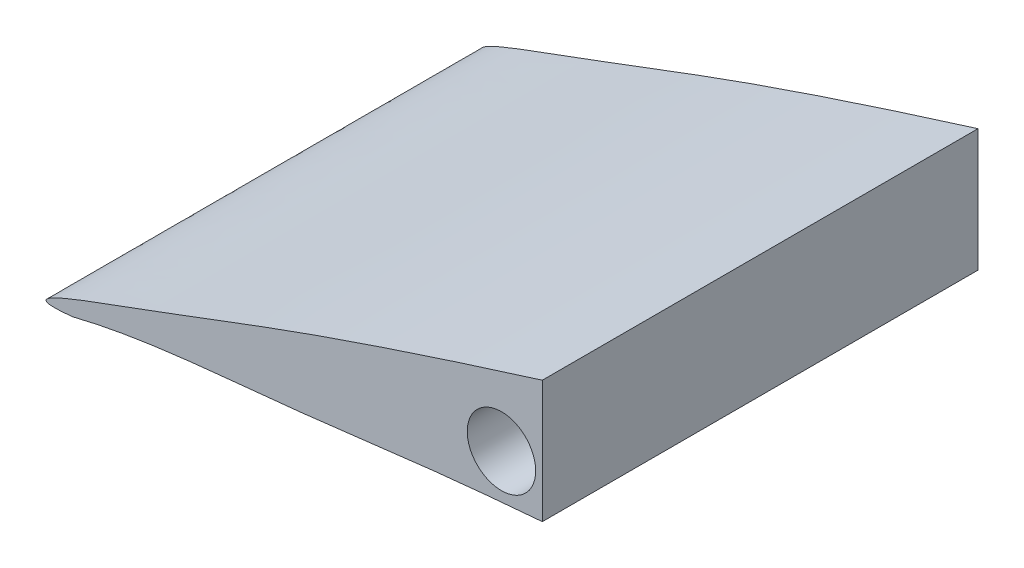
ISO-10303-21;
HEADER;
FILE_DESCRIPTION(('STEP AP214'),'2;1');
FILE_NAME('part.step','',(''),(''),'','','');
FILE_SCHEMA(('AUTOMOTIVE_DESIGN { 1 0 10303 214 1 1 1 1 }'));
ENDSEC;
DATA;
#1=APPLICATION_CONTEXT('core data for automotive mechanical design processes');
#2=APPLICATION_PROTOCOL_DEFINITION('international standard','automotive_design',2000,#1);
#3=PRODUCT_CONTEXT('',#1,'mechanical');
#4=PRODUCT('Part','Part','',(#3));
#5=PRODUCT_RELATED_PRODUCT_CATEGORY('part','',(#4));
#6=PRODUCT_DEFINITION_FORMATION('','',#4);
#7=PRODUCT_DEFINITION_CONTEXT('part definition',#1,'design');
#8=PRODUCT_DEFINITION('design','',#6,#7);
#9=PRODUCT_DEFINITION_SHAPE('','',#8);
#10=(LENGTH_UNIT() NAMED_UNIT(*) SI_UNIT(.MILLI.,.METRE.));
#11=(NAMED_UNIT(*) PLANE_ANGLE_UNIT() SI_UNIT($,.RADIAN.));
#12=(NAMED_UNIT(*) SI_UNIT($,.STERADIAN.) SOLID_ANGLE_UNIT());
#13=UNCERTAINTY_MEASURE_WITH_UNIT(LENGTH_MEASURE(1.E-05),#10,'distance_accuracy_value','');
#14=(GEOMETRIC_REPRESENTATION_CONTEXT(3) GLOBAL_UNCERTAINTY_ASSIGNED_CONTEXT((#13)) GLOBAL_UNIT_ASSIGNED_CONTEXT((#10,
#11,#12)) REPRESENTATION_CONTEXT('',''));
#15=CARTESIAN_POINT('',(0.,0.,0.));
#16=DIRECTION('',(0.,0.,1.));
#17=DIRECTION('',(1.,0.,0.));
#18=AXIS2_PLACEMENT_3D('',#15,#16,#17);
#19=CARTESIAN_POINT('',(-6.3156767121804,2.1580285927083,27.0764));
#20=DIRECTION('',(0.,0.,-1.));
#21=DIRECTION('',(-1.,0.,0.));
#22=AXIS2_PLACEMENT_3D('',#19,#20,#21);
#23=PLANE('',#22);
#24=CARTESIAN_POINT('',(-45.7724895500792,-12.1068503903365,27.0764));
#25=CARTESIAN_POINT('',(-41.3374436992652,-10.9992654887815,27.0764));
#26=CARTESIAN_POINT('',(-33.8316096279073,-10.5300430967119,27.0764));
#27=CARTESIAN_POINT('',(-20.4834982570784,-8.70754719775505,27.0764));
#28=CARTESIAN_POINT('',(-8.87343365419412,-8.01917435004237,27.0764));
#29=CARTESIAN_POINT('',(11.5245885947209,-6.02817132263064,27.0764));
#30=CARTESIAN_POINT('',(26.0673219730606,-5.65978493925108,27.0764));
#31=CARTESIAN_POINT('',(37.8951419594641,-5.52742505549688,27.0764));
#32=B_SPLINE_CURVE_WITH_KNOTS('',3,(#24,#25,#26,#27,#28,#29,#30,#31),.UNSPECIFIED.,.F.,.F.,(4,1,
1,1,1,4),(0.,0.144322392153104,0.23794765175378,0.427122749709389,0.512831912207282,
0.887817721212676),.UNSPECIFIED.);
#33=CARTESIAN_POINT('',(-45.7724895500792,-12.1068503903365,27.0764));
#34=VERTEX_POINT('',#33);
#35=CARTESIAN_POINT('',(-16.5624895500791,-8.53623661907283,27.0764));
#36=VERTEX_POINT('',#35);
#37=EDGE_CURVE('E84',#34,#36,#32,.T.);
#38=ORIENTED_EDGE('',*,*,#37,.T.);
#39=DIRECTION('',(0.,-1.,0.));
#40=VECTOR('',#39,1.);
#41=CARTESIAN_POINT('',(-16.5624895500792,14.1187599185989,27.0764));
#42=LINE('',#41,#40);
#43=CARTESIAN_POINT('',(-16.5624895500792,-0.920841797350323,27.0764));
#44=VERTEX_POINT('',#43);
#45=EDGE_CURVE('E56',#44,#36,#42,.T.);
#46=ORIENTED_EDGE('',*,*,#45,.F.);
#47=CARTESIAN_POINT('',(36.6810985985652,13.2095369144677,27.0764));
#48=CARTESIAN_POINT('',(19.8297656446093,9.26724001295322,27.0764));
#49=CARTESIAN_POINT('',(-2.07358994292178,3.84406830419772,27.0764));
#50=CARTESIAN_POINT('',(-31.0964662188296,-5.54591449337639,27.0764));
#51=CARTESIAN_POINT('',(-39.3167651645247,-8.80663166059082,27.0764));
#52=CARTESIAN_POINT('',(-49.5155563234086,-12.4956604853466,27.0764));
#53=CARTESIAN_POINT('',(-45.7724895500792,-12.1068503903365,27.0764));
#54=B_SPLINE_CURVE_WITH_KNOTS('',3,(#47,#48,#49,#50,#51,#52,#53),.UNSPECIFIED.,.F.,.F.,(4,1,1,1,
4),(0.118068853294986,0.630725310694853,0.824213609270468,0.940085476785923,1.),.UNSPECIFIED.);
#55=EDGE_CURVE('E63',#44,#34,#54,.T.);
#56=ORIENTED_EDGE('',*,*,#55,.T.);
#57=EDGE_LOOP('',(#38,#46,#56));
#58=FACE_BOUND('',#57,.T.);
#59=CARTESIAN_POINT('',(-19.1024895500792,-6.01085039033649,27.0764));
#60=DIRECTION('',(0.,0.,1.));
#61=DIRECTION('',(1.,0.,0.));
#62=AXIS2_PLACEMENT_3D('',#59,#60,#61);
#63=CIRCLE('',#62,2.127);
#64=CARTESIAN_POINT('',(-16.9754895500792,-6.01085039033649,27.0764));
#65=VERTEX_POINT('',#64);
#66=EDGE_CURVE('E169',#65,#65,#63,.T.);
#67=ORIENTED_EDGE('',*,*,#66,.F.);
#68=EDGE_LOOP('',(#67));
#69=FACE_BOUND('',#68,.T.);
#70=ADVANCED_FACE('F39',(#58,#69),#23,.F.);
#71=CARTESIAN_POINT('',(-6.3156767121804,2.1580285927083,0.));
#72=DIRECTION('',(0.,0.,-1.));
#73=DIRECTION('',(-1.,0.,0.));
#74=AXIS2_PLACEMENT_3D('',#71,#72,#73);
#75=PLANE('',#74);
#76=DIRECTION('',(0.,-1.,0.));
#77=VECTOR('',#76,1.);
#78=CARTESIAN_POINT('',(-16.5624895500792,14.1187599185989,0.));
#79=LINE('',#78,#77);
#80=CARTESIAN_POINT('',(-16.5624895500792,-0.920841797350323,0.));
#81=VERTEX_POINT('',#80);
#82=CARTESIAN_POINT('',(-16.5624895500792,-8.53623661907283,0.));
#83=VERTEX_POINT('',#82);
#84=EDGE_CURVE('E77',#81,#83,#79,.T.);
#85=ORIENTED_EDGE('',*,*,#84,.T.);
#86=CARTESIAN_POINT('',(-45.7724895500792,-12.1068503903365,0.));
#87=CARTESIAN_POINT('',(-41.3374436992652,-10.9992654887815,0.));
#88=CARTESIAN_POINT('',(-33.8316096279073,-10.5300430967119,0.));
#89=CARTESIAN_POINT('',(-20.4834982570784,-8.70754719775505,0.));
#90=CARTESIAN_POINT('',(-8.87343365419412,-8.01917435004237,0.));
#91=CARTESIAN_POINT('',(11.5245885947209,-6.02817132263064,0.));
#92=CARTESIAN_POINT('',(26.0673219730606,-5.65978493925108,0.));
#93=CARTESIAN_POINT('',(37.8951419594641,-5.52742505549688,0.));
#94=B_SPLINE_CURVE_WITH_KNOTS('',3,(#86,#87,#88,#89,#90,#91,#92,#93),.UNSPECIFIED.,.F.,.F.,(4,1,
1,1,1,4),(0.,0.144322392153104,0.23794765175378,0.427122749709389,0.512831912207282,
0.887817721212676),.UNSPECIFIED.);
#95=CARTESIAN_POINT('',(-45.7724895500792,-12.1068503903365,0.));
#96=VERTEX_POINT('',#95);
#97=EDGE_CURVE('E90',#96,#83,#94,.T.);
#98=ORIENTED_EDGE('',*,*,#97,.F.);
#99=CARTESIAN_POINT('',(36.6810985985652,13.2095369144677,0.));
#100=CARTESIAN_POINT('',(19.8297656446093,9.26724001295322,0.));
#101=CARTESIAN_POINT('',(-2.07358994292178,3.84406830419772,0.));
#102=CARTESIAN_POINT('',(-31.0964662188296,-5.54591449337639,0.));
#103=CARTESIAN_POINT('',(-39.3167651645247,-8.80663166059082,0.));
#104=CARTESIAN_POINT('',(-49.5155563234086,-12.4956604853466,0.));
#105=CARTESIAN_POINT('',(-45.7724895500792,-12.1068503903365,0.));
#106=B_SPLINE_CURVE_WITH_KNOTS('',3,(#99,#100,#101,#102,#103,#104,#105),.UNSPECIFIED.,.F.,.F.,
(4,1,1,1,4),(0.118068853294986,0.630725310694853,0.824213609270468,0.940085476785923,1.),.UNSPECIFIED.);
#107=EDGE_CURVE('E95',#81,#96,#106,.T.);
#108=ORIENTED_EDGE('',*,*,#107,.F.);
#109=EDGE_LOOP('',(#85,#98,#108));
#110=FACE_BOUND('',#109,.T.);
#111=CARTESIAN_POINT('',(-19.1024895500792,-6.01085039033649,0.));
#112=DIRECTION('',(0.,0.,1.));
#113=DIRECTION('',(1.,0.,0.));
#114=AXIS2_PLACEMENT_3D('',#111,#112,#113);
#115=CIRCLE('',#114,2.127);
#116=CARTESIAN_POINT('',(-16.9754895500792,-6.01085039033649,0.));
#117=VERTEX_POINT('',#116);
#118=EDGE_CURVE('E81',#117,#117,#115,.T.);
#119=ORIENTED_EDGE('',*,*,#118,.T.);
#120=EDGE_LOOP('',(#119));
#121=FACE_BOUND('',#120,.T.);
#122=ADVANCED_FACE('F119',(#110,#121),#75,.T.);
#123=DIRECTION('',(0.,0.,-1.));
#124=VECTOR('',#123,1.);
#125=SURFACE_OF_LINEAR_EXTRUSION('',#54,#124);
#126=ORIENTED_EDGE('',*,*,#55,.F.);
#127=DIRECTION('',(0.,0.,-1.));
#128=VECTOR('',#127,1.);
#129=CARTESIAN_POINT('',(-16.5624895500792,-0.920841796934104,27.0764));
#130=LINE('',#129,#128);
#131=EDGE_CURVE('E74',#44,#81,#130,.T.);
#132=ORIENTED_EDGE('',*,*,#131,.T.);
#133=ORIENTED_EDGE('',*,*,#107,.T.);
#134=DIRECTION('',(0.,0.,-1.));
#135=VECTOR('',#134,1.);
#136=CARTESIAN_POINT('',(-45.7724895500792,-12.1068503903365,27.0764));
#137=LINE('',#136,#135);
#138=EDGE_CURVE('E49',#34,#96,#137,.T.);
#139=ORIENTED_EDGE('',*,*,#138,.F.);
#140=EDGE_LOOP('',(#126,#132,#133,#139));
#141=FACE_BOUND('',#140,.T.);
#142=ADVANCED_FACE('F41',(#141),#125,.F.);
#143=DIRECTION('',(0.,0.,-1.));
#144=VECTOR('',#143,1.);
#145=SURFACE_OF_LINEAR_EXTRUSION('',#32,#144);
#146=ORIENTED_EDGE('',*,*,#97,.T.);
#147=DIRECTION('',(0.,0.,-1.));
#148=VECTOR('',#147,1.);
#149=CARTESIAN_POINT('',(-16.5624895500792,-8.53623661907284,27.0764));
#150=LINE('',#149,#148);
#151=EDGE_CURVE('E11',#83,#36,#150,.F.);
#152=ORIENTED_EDGE('',*,*,#151,.T.);
#153=ORIENTED_EDGE('',*,*,#37,.F.);
#154=ORIENTED_EDGE('',*,*,#138,.T.);
#155=EDGE_LOOP('',(#146,#152,#153,#154));
#156=FACE_BOUND('',#155,.T.);
#157=ADVANCED_FACE('F114',(#156),#145,.F.);
#158=CARTESIAN_POINT('',(-19.1024895500792,-6.01085039033649,27.0764));
#159=DIRECTION('',(0.,0.,-1.));
#160=DIRECTION('',(-1.,0.,0.));
#161=AXIS2_PLACEMENT_3D('',#158,#159,#160);
#162=CYLINDRICAL_SURFACE('',#161,2.127);
#163=ORIENTED_EDGE('',*,*,#66,.T.);
#164=EDGE_LOOP('',(#163));
#165=FACE_BOUND('',#164,.T.);
#166=ORIENTED_EDGE('',*,*,#118,.F.);
#167=EDGE_LOOP('',(#166));
#168=FACE_BOUND('',#167,.T.);
#169=ADVANCED_FACE('F117',(#165,#168),#162,.F.);
#170=CARTESIAN_POINT('',(-16.5624895500792,14.1187599185989,0.));
#171=DIRECTION('',(-1.,0.,0.));
#172=DIRECTION('',(0.,-1.,0.));
#173=AXIS2_PLACEMENT_3D('',#170,#171,#172);
#174=PLANE('',#173);
#175=ORIENTED_EDGE('',*,*,#45,.T.);
#176=ORIENTED_EDGE('',*,*,#151,.F.);
#177=ORIENTED_EDGE('',*,*,#84,.F.);
#178=ORIENTED_EDGE('',*,*,#131,.F.);
#179=EDGE_LOOP('',(#175,#176,#177,#178));
#180=FACE_BOUND('',#179,.T.);
#181=ADVANCED_FACE('F75',(#180),#174,.F.);
#182=CLOSED_SHELL('',(#70,#122,#142,#157,#169,#181));
#183=MANIFOLD_SOLID_BREP('B2',#182);
#184=ADVANCED_BREP_SHAPE_REPRESENTATION('',(#18,#183),#14);
#185=SHAPE_DEFINITION_REPRESENTATION(#9,#184);
ENDSEC;
END-ISO-10303-21;
